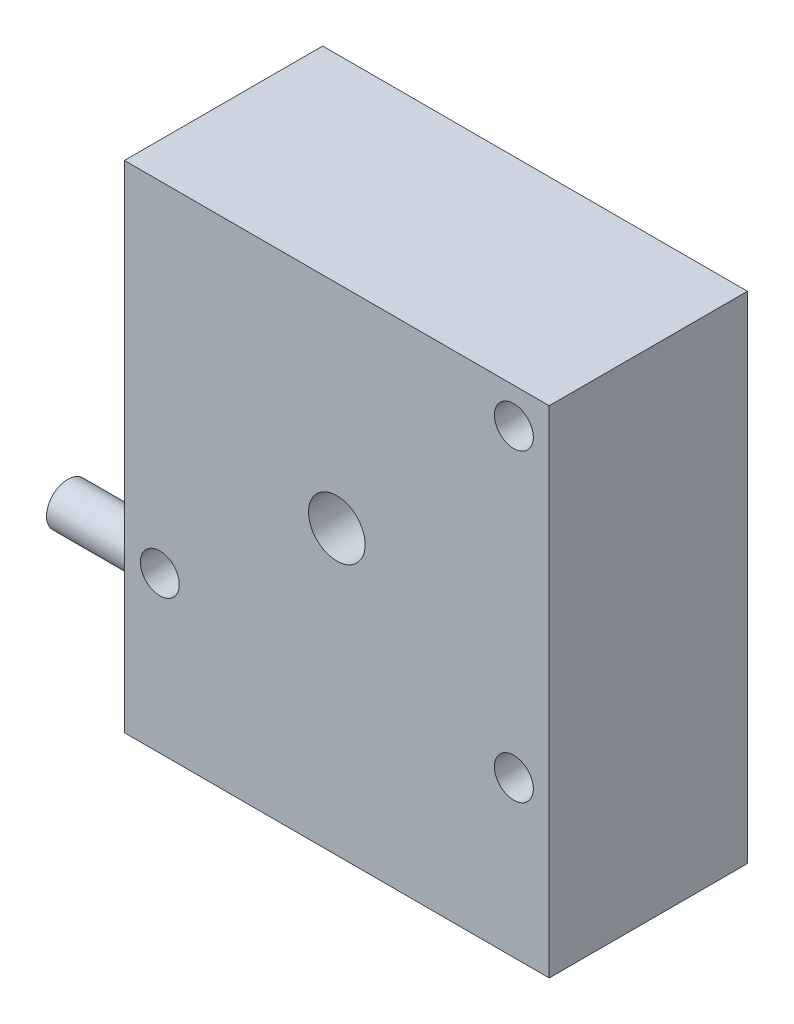
ISO-10303-21;
HEADER;
FILE_DESCRIPTION(('STEP AP214'),'2;1');
FILE_NAME('part.step','',(''),(''),'','','');
FILE_SCHEMA(('AUTOMOTIVE_DESIGN { 1 0 10303 214 1 1 1 1 }'));
ENDSEC;
DATA;
#1=APPLICATION_CONTEXT('core data for automotive mechanical design processes');
#2=APPLICATION_PROTOCOL_DEFINITION('international standard','automotive_design',2000,#1);
#3=PRODUCT_CONTEXT('',#1,'mechanical');
#4=PRODUCT('Part','Part','',(#3));
#5=PRODUCT_RELATED_PRODUCT_CATEGORY('part','',(#4));
#6=PRODUCT_DEFINITION_FORMATION('','',#4);
#7=PRODUCT_DEFINITION_CONTEXT('part definition',#1,'design');
#8=PRODUCT_DEFINITION('design','',#6,#7);
#9=PRODUCT_DEFINITION_SHAPE('','',#8);
#10=(LENGTH_UNIT() NAMED_UNIT(*) SI_UNIT(.MILLI.,.METRE.));
#11=(NAMED_UNIT(*) PLANE_ANGLE_UNIT() SI_UNIT($,.RADIAN.));
#12=(NAMED_UNIT(*) SI_UNIT($,.STERADIAN.) SOLID_ANGLE_UNIT());
#13=UNCERTAINTY_MEASURE_WITH_UNIT(LENGTH_MEASURE(1.E-05),#10,'distance_accuracy_value','');
#14=(GEOMETRIC_REPRESENTATION_CONTEXT(3) GLOBAL_UNCERTAINTY_ASSIGNED_CONTEXT((#13)) GLOBAL_UNIT_ASSIGNED_CONTEXT((#10,
#11,#12)) REPRESENTATION_CONTEXT('',''));
#15=CARTESIAN_POINT('',(0.,0.,0.));
#16=DIRECTION('',(0.,0.,1.));
#17=DIRECTION('',(1.,0.,0.));
#18=AXIS2_PLACEMENT_3D('',#15,#16,#17);
#19=CARTESIAN_POINT('',(0.,0.,-28.));
#20=DIRECTION('',(-1.,0.,0.));
#21=DIRECTION('',(0.,0.,1.));
#22=AXIS2_PLACEMENT_3D('',#19,#20,#21);
#23=PLANE('',#22);
#24=DIRECTION('',(0.,-1.,0.));
#25=VECTOR('',#24,1.);
#26=CARTESIAN_POINT('',(0.,0.,0.));
#27=LINE('',#26,#25);
#28=CARTESIAN_POINT('',(0.,70.,0.));
#29=VERTEX_POINT('',#28);
#30=CARTESIAN_POINT('',(0.,0.,0.));
#31=VERTEX_POINT('',#30);
#32=EDGE_CURVE('E97',#29,#31,#27,.T.);
#33=ORIENTED_EDGE('',*,*,#32,.F.);
#34=DIRECTION('',(0.,0.,1.));
#35=VECTOR('',#34,1.);
#36=CARTESIAN_POINT('',(0.,70.,-28.));
#37=LINE('',#36,#35);
#38=CARTESIAN_POINT('',(0.,70.,-28.));
#39=VERTEX_POINT('',#38);
#40=EDGE_CURVE('E11',#39,#29,#37,.T.);
#41=ORIENTED_EDGE('',*,*,#40,.F.);
#42=DIRECTION('',(0.,-1.,0.));
#43=VECTOR('',#42,1.);
#44=CARTESIAN_POINT('',(0.,0.,-28.));
#45=LINE('',#44,#43);
#46=CARTESIAN_POINT('',(0.,0.,-28.));
#47=VERTEX_POINT('',#46);
#48=EDGE_CURVE('E90',#39,#47,#45,.T.);
#49=ORIENTED_EDGE('',*,*,#48,.T.);
#50=DIRECTION('',(0.,0.,1.));
#51=VECTOR('',#50,1.);
#52=CARTESIAN_POINT('',(0.,0.,-28.));
#53=LINE('',#52,#51);
#54=EDGE_CURVE('E35',#47,#31,#53,.T.);
#55=ORIENTED_EDGE('',*,*,#54,.T.);
#56=EDGE_LOOP('',(#33,#41,#49,#55));
#57=FACE_BOUND('',#56,.T.);
#58=CARTESIAN_POINT('',(0.,10.,-14.));
#59=DIRECTION('',(-1.,0.,0.));
#60=DIRECTION('',(0.,0.,1.));
#61=AXIS2_PLACEMENT_3D('',#58,#59,#60);
#62=CIRCLE('',#61,3.);
#63=CARTESIAN_POINT('',(0.,10.,-11.));
#64=VERTEX_POINT('',#63);
#65=EDGE_CURVE('E180',#64,#64,#62,.T.);
#66=ORIENTED_EDGE('',*,*,#65,.F.);
#67=EDGE_LOOP('',(#66));
#68=FACE_BOUND('',#67,.T.);
#69=ADVANCED_FACE('F32',(#57,#68),#23,.T.);
#70=CARTESIAN_POINT('',(0.,70.,-28.));
#71=DIRECTION('',(0.,1.,0.));
#72=DIRECTION('',(0.,0.,1.));
#73=AXIS2_PLACEMENT_3D('',#70,#71,#72);
#74=PLANE('',#73);
#75=DIRECTION('',(-1.,0.,0.));
#76=VECTOR('',#75,1.);
#77=CARTESIAN_POINT('',(0.,70.,0.));
#78=LINE('',#77,#76);
#79=CARTESIAN_POINT('',(60.,70.,0.));
#80=VERTEX_POINT('',#79);
#81=EDGE_CURVE('E92',#80,#29,#78,.T.);
#82=ORIENTED_EDGE('',*,*,#81,.F.);
#83=DIRECTION('',(0.,0.,1.));
#84=VECTOR('',#83,1.);
#85=CARTESIAN_POINT('',(60.,70.,-28.));
#86=LINE('',#85,#84);
#87=CARTESIAN_POINT('',(60.,70.,-28.));
#88=VERTEX_POINT('',#87);
#89=EDGE_CURVE('E41',#88,#80,#86,.T.);
#90=ORIENTED_EDGE('',*,*,#89,.F.);
#91=DIRECTION('',(-1.,0.,0.));
#92=VECTOR('',#91,1.);
#93=CARTESIAN_POINT('',(0.,70.,-28.));
#94=LINE('',#93,#92);
#95=EDGE_CURVE('E87',#88,#39,#94,.T.);
#96=ORIENTED_EDGE('',*,*,#95,.T.);
#97=ORIENTED_EDGE('',*,*,#40,.T.);
#98=EDGE_LOOP('',(#82,#90,#96,#97));
#99=FACE_BOUND('',#98,.T.);
#100=ADVANCED_FACE('F108',(#99),#74,.T.);
#101=CARTESIAN_POINT('',(60.,0.,-28.));
#102=DIRECTION('',(1.,0.,0.));
#103=DIRECTION('',(0.,0.,-1.));
#104=AXIS2_PLACEMENT_3D('',#101,#102,#103);
#105=PLANE('',#104);
#106=DIRECTION('',(0.,1.,0.));
#107=VECTOR('',#106,1.);
#108=CARTESIAN_POINT('',(60.,0.,0.));
#109=LINE('',#108,#107);
#110=CARTESIAN_POINT('',(60.,0.,0.));
#111=VERTEX_POINT('',#110);
#112=EDGE_CURVE('E82',#111,#80,#109,.T.);
#113=ORIENTED_EDGE('',*,*,#112,.F.);
#114=DIRECTION('',(0.,0.,1.));
#115=VECTOR('',#114,1.);
#116=CARTESIAN_POINT('',(60.,0.,-28.));
#117=LINE('',#116,#115);
#118=CARTESIAN_POINT('',(60.,0.,-28.));
#119=VERTEX_POINT('',#118);
#120=EDGE_CURVE('E77',#119,#111,#117,.T.);
#121=ORIENTED_EDGE('',*,*,#120,.F.);
#122=DIRECTION('',(0.,1.,0.));
#123=VECTOR('',#122,1.);
#124=CARTESIAN_POINT('',(60.,0.,-28.));
#125=LINE('',#124,#123);
#126=EDGE_CURVE('E80',#119,#88,#125,.T.);
#127=ORIENTED_EDGE('',*,*,#126,.T.);
#128=ORIENTED_EDGE('',*,*,#89,.T.);
#129=EDGE_LOOP('',(#113,#121,#127,#128));
#130=FACE_BOUND('',#129,.T.);
#131=ADVANCED_FACE('F79',(#130),#105,.T.);
#132=CARTESIAN_POINT('',(0.,0.,-28.));
#133=DIRECTION('',(0.,-1.,0.));
#134=DIRECTION('',(0.,0.,-1.));
#135=AXIS2_PLACEMENT_3D('',#132,#133,#134);
#136=PLANE('',#135);
#137=DIRECTION('',(1.,0.,0.));
#138=VECTOR('',#137,1.);
#139=CARTESIAN_POINT('',(0.,0.,0.));
#140=LINE('',#139,#138);
#141=EDGE_CURVE('E100',#31,#111,#140,.T.);
#142=ORIENTED_EDGE('',*,*,#141,.F.);
#143=ORIENTED_EDGE('',*,*,#54,.F.);
#144=DIRECTION('',(1.,0.,0.));
#145=VECTOR('',#144,1.);
#146=CARTESIAN_POINT('',(0.,0.,-28.));
#147=LINE('',#146,#145);
#148=EDGE_CURVE('E86',#47,#119,#147,.T.);
#149=ORIENTED_EDGE('',*,*,#148,.T.);
#150=ORIENTED_EDGE('',*,*,#120,.T.);
#151=EDGE_LOOP('',(#142,#143,#149,#150));
#152=FACE_BOUND('',#151,.T.);
#153=ADVANCED_FACE('F89',(#152),#136,.T.);
#154=CARTESIAN_POINT('',(0.,70.,-28.));
#155=DIRECTION('',(0.,0.,-1.));
#156=DIRECTION('',(-1.,0.,0.));
#157=AXIS2_PLACEMENT_3D('',#154,#155,#156);
#158=PLANE('',#157);
#159=CARTESIAN_POINT('',(55.,22.,-28.));
#160=DIRECTION('',(0.,0.,-1.));
#161=DIRECTION('',(-1.,0.,0.));
#162=AXIS2_PLACEMENT_3D('',#159,#160,#161);
#163=CIRCLE('',#162,2.74999999999999);
#164=CARTESIAN_POINT('',(52.25,22.,-28.));
#165=VERTEX_POINT('',#164);
#166=EDGE_CURVE('E160',#165,#165,#163,.T.);
#167=ORIENTED_EDGE('',*,*,#166,.F.);
#168=EDGE_LOOP('',(#167));
#169=FACE_BOUND('',#168,.T.);
#170=CARTESIAN_POINT('',(55.,65.,-28.));
#171=DIRECTION('',(0.,0.,-1.));
#172=DIRECTION('',(-1.,0.,0.));
#173=AXIS2_PLACEMENT_3D('',#170,#171,#172);
#174=CIRCLE('',#173,2.74999999999999);
#175=CARTESIAN_POINT('',(52.25,65.,-28.));
#176=VERTEX_POINT('',#175);
#177=EDGE_CURVE('E162',#176,#176,#174,.T.);
#178=ORIENTED_EDGE('',*,*,#177,.F.);
#179=EDGE_LOOP('',(#178));
#180=FACE_BOUND('',#179,.T.);
#181=CARTESIAN_POINT('',(5.,22.,-28.));
#182=DIRECTION('',(0.,0.,-1.));
#183=DIRECTION('',(-1.,0.,0.));
#184=AXIS2_PLACEMENT_3D('',#181,#182,#183);
#185=CIRCLE('',#184,2.74999999999999);
#186=CARTESIAN_POINT('',(2.25000000000001,22.,-28.));
#187=VERTEX_POINT('',#186);
#188=EDGE_CURVE('E170',#187,#187,#185,.T.);
#189=ORIENTED_EDGE('',*,*,#188,.F.);
#190=EDGE_LOOP('',(#189));
#191=FACE_BOUND('',#190,.T.);
#192=CARTESIAN_POINT('',(30.,40.,-28.));
#193=DIRECTION('',(0.,0.,-1.));
#194=DIRECTION('',(-1.,0.,0.));
#195=AXIS2_PLACEMENT_3D('',#192,#193,#194);
#196=CIRCLE('',#195,4.00000000000001);
#197=CARTESIAN_POINT('',(26.,40.,-28.));
#198=VERTEX_POINT('',#197);
#199=EDGE_CURVE('E176',#198,#198,#196,.F.);
#200=ORIENTED_EDGE('',*,*,#199,.T.);
#201=EDGE_LOOP('',(#200));
#202=FACE_BOUND('',#201,.T.);
#203=ORIENTED_EDGE('',*,*,#48,.F.);
#204=ORIENTED_EDGE('',*,*,#95,.F.);
#205=ORIENTED_EDGE('',*,*,#126,.F.);
#206=ORIENTED_EDGE('',*,*,#148,.F.);
#207=EDGE_LOOP('',(#203,#204,#205,#206));
#208=FACE_BOUND('',#207,.T.);
#209=ADVANCED_FACE('F85',(#169,#180,#191,#202,#208),#158,.T.);
#210=CARTESIAN_POINT('',(0.,70.,0.));
#211=DIRECTION('',(0.,0.,-1.));
#212=DIRECTION('',(-1.,0.,0.));
#213=AXIS2_PLACEMENT_3D('',#210,#211,#212);
#214=PLANE('',#213);
#215=CARTESIAN_POINT('',(55.,22.,0.));
#216=DIRECTION('',(0.,0.,-1.));
#217=DIRECTION('',(-1.,0.,0.));
#218=AXIS2_PLACEMENT_3D('',#215,#216,#217);
#219=CIRCLE('',#218,2.75);
#220=CARTESIAN_POINT('',(52.25,22.,0.));
#221=VERTEX_POINT('',#220);
#222=EDGE_CURVE('E158',#221,#221,#219,.T.);
#223=ORIENTED_EDGE('',*,*,#222,.T.);
#224=EDGE_LOOP('',(#223));
#225=FACE_BOUND('',#224,.T.);
#226=CARTESIAN_POINT('',(55.,65.,0.));
#227=DIRECTION('',(0.,0.,-1.));
#228=DIRECTION('',(-1.,0.,0.));
#229=AXIS2_PLACEMENT_3D('',#226,#227,#228);
#230=CIRCLE('',#229,2.75);
#231=CARTESIAN_POINT('',(52.25,65.,0.));
#232=VERTEX_POINT('',#231);
#233=EDGE_CURVE('E167',#232,#232,#230,.T.);
#234=ORIENTED_EDGE('',*,*,#233,.T.);
#235=EDGE_LOOP('',(#234));
#236=FACE_BOUND('',#235,.T.);
#237=CARTESIAN_POINT('',(5.,22.,0.));
#238=DIRECTION('',(0.,0.,-1.));
#239=DIRECTION('',(-1.,0.,0.));
#240=AXIS2_PLACEMENT_3D('',#237,#238,#239);
#241=CIRCLE('',#240,2.75);
#242=CARTESIAN_POINT('',(2.25,22.,0.));
#243=VERTEX_POINT('',#242);
#244=EDGE_CURVE('E173',#243,#243,#241,.T.);
#245=ORIENTED_EDGE('',*,*,#244,.T.);
#246=EDGE_LOOP('',(#245));
#247=FACE_BOUND('',#246,.T.);
#248=CARTESIAN_POINT('',(30.,40.,0.));
#249=DIRECTION('',(0.,0.,1.));
#250=DIRECTION('',(1.,0.,0.));
#251=AXIS2_PLACEMENT_3D('',#248,#249,#250);
#252=CIRCLE('',#251,4.00000000000001);
#253=CARTESIAN_POINT('',(34.,40.,0.));
#254=VERTEX_POINT('',#253);
#255=EDGE_CURVE('E177',#254,#254,#252,.T.);
#256=ORIENTED_EDGE('',*,*,#255,.F.);
#257=EDGE_LOOP('',(#256));
#258=FACE_BOUND('',#257,.T.);
#259=ORIENTED_EDGE('',*,*,#32,.T.);
#260=ORIENTED_EDGE('',*,*,#141,.T.);
#261=ORIENTED_EDGE('',*,*,#112,.T.);
#262=ORIENTED_EDGE('',*,*,#81,.T.);
#263=EDGE_LOOP('',(#259,#260,#261,#262));
#264=FACE_BOUND('',#263,.T.);
#265=ADVANCED_FACE('F107',(#225,#236,#247,#258,#264),#214,.F.);
#266=CARTESIAN_POINT('',(-22.,10.,-14.));
#267=DIRECTION('',(1.,0.,0.));
#268=DIRECTION('',(0.,0.,-1.));
#269=AXIS2_PLACEMENT_3D('',#266,#267,#268);
#270=CYLINDRICAL_SURFACE('',#269,3.);
#271=CARTESIAN_POINT('',(-22.,10.,-14.));
#272=DIRECTION('',(-1.,0.,0.));
#273=DIRECTION('',(0.,0.,1.));
#274=AXIS2_PLACEMENT_3D('',#271,#272,#273);
#275=CIRCLE('',#274,3.);
#276=CARTESIAN_POINT('',(-22.,10.,-11.));
#277=VERTEX_POINT('',#276);
#278=EDGE_CURVE('E101',#277,#277,#275,.T.);
#279=ORIENTED_EDGE('',*,*,#278,.F.);
#280=EDGE_LOOP('',(#279));
#281=FACE_BOUND('',#280,.T.);
#282=ORIENTED_EDGE('',*,*,#65,.T.);
#283=EDGE_LOOP('',(#282));
#284=FACE_BOUND('',#283,.T.);
#285=ADVANCED_FACE('F126',(#281,#284),#270,.T.);
#286=CARTESIAN_POINT('',(-22.,10.,-14.));
#287=DIRECTION('',(-1.,0.,0.));
#288=DIRECTION('',(0.,0.,1.));
#289=AXIS2_PLACEMENT_3D('',#286,#287,#288);
#290=PLANE('',#289);
#291=ORIENTED_EDGE('',*,*,#278,.T.);
#292=EDGE_LOOP('',(#291));
#293=FACE_BOUND('',#292,.T.);
#294=ADVANCED_FACE('F133',(#293),#290,.T.);
#295=CARTESIAN_POINT('',(30.,40.,-28.001));
#296=DIRECTION('',(0.,0.,1.));
#297=DIRECTION('',(1.,0.,0.));
#298=AXIS2_PLACEMENT_3D('',#295,#296,#297);
#299=CYLINDRICAL_SURFACE('',#298,4.00000000000001);
#300=ORIENTED_EDGE('',*,*,#199,.F.);
#301=EDGE_LOOP('',(#300));
#302=FACE_BOUND('',#301,.T.);
#303=ORIENTED_EDGE('',*,*,#255,.T.);
#304=EDGE_LOOP('',(#303));
#305=FACE_BOUND('',#304,.T.);
#306=ADVANCED_FACE('F137',(#302,#305),#299,.F.);
#307=CARTESIAN_POINT('',(5.,22.,-28.));
#308=DIRECTION('',(0.,0.,-1.));
#309=DIRECTION('',(-1.,0.,0.));
#310=AXIS2_PLACEMENT_3D('',#307,#308,#309);
#311=CYLINDRICAL_SURFACE('',#310,2.74999999999999);
#312=ORIENTED_EDGE('',*,*,#244,.F.);
#313=EDGE_LOOP('',(#312));
#314=FACE_BOUND('',#313,.T.);
#315=ORIENTED_EDGE('',*,*,#188,.T.);
#316=EDGE_LOOP('',(#315));
#317=FACE_BOUND('',#316,.T.);
#318=ADVANCED_FACE('F141',(#314,#317),#311,.F.);
#319=CARTESIAN_POINT('',(55.,65.,-28.));
#320=DIRECTION('',(0.,0.,-1.));
#321=DIRECTION('',(-1.,0.,0.));
#322=AXIS2_PLACEMENT_3D('',#319,#320,#321);
#323=CYLINDRICAL_SURFACE('',#322,2.74999999999999);
#324=ORIENTED_EDGE('',*,*,#233,.F.);
#325=EDGE_LOOP('',(#324));
#326=FACE_BOUND('',#325,.T.);
#327=ORIENTED_EDGE('',*,*,#177,.T.);
#328=EDGE_LOOP('',(#327));
#329=FACE_BOUND('',#328,.T.);
#330=ADVANCED_FACE('F145',(#326,#329),#323,.F.);
#331=CARTESIAN_POINT('',(55.,22.,-28.));
#332=DIRECTION('',(0.,0.,-1.));
#333=DIRECTION('',(-1.,0.,0.));
#334=AXIS2_PLACEMENT_3D('',#331,#332,#333);
#335=CYLINDRICAL_SURFACE('',#334,2.74999999999999);
#336=ORIENTED_EDGE('',*,*,#222,.F.);
#337=EDGE_LOOP('',(#336));
#338=FACE_BOUND('',#337,.T.);
#339=ORIENTED_EDGE('',*,*,#166,.T.);
#340=EDGE_LOOP('',(#339));
#341=FACE_BOUND('',#340,.T.);
#342=ADVANCED_FACE('F149',(#338,#341),#335,.F.);
#343=CLOSED_SHELL('',(#69,#100,#131,#153,#209,#265,#285,#294,#306,#318,#330,#342));
#344=MANIFOLD_SOLID_BREP('B2',#343);
#345=ADVANCED_BREP_SHAPE_REPRESENTATION('',(#18,#344),#14);
#346=SHAPE_DEFINITION_REPRESENTATION(#9,#345);
ENDSEC;
END-ISO-10303-21;
